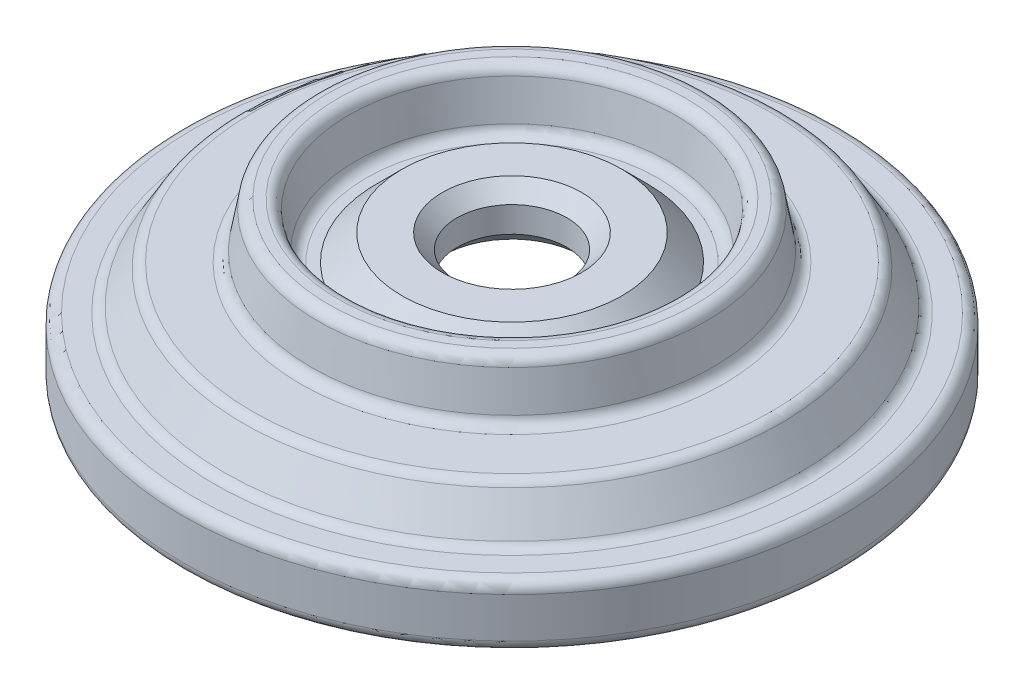
ISO-10303-21;
HEADER;
FILE_DESCRIPTION(('STEP AP214'),'2;1');
FILE_NAME('part.step','',(''),(''),'','','');
FILE_SCHEMA(('AUTOMOTIVE_DESIGN { 1 0 10303 214 1 1 1 1 }'));
ENDSEC;
DATA;
#1=APPLICATION_CONTEXT('core data for automotive mechanical design processes');
#2=APPLICATION_PROTOCOL_DEFINITION('international standard','automotive_design',2000,#1);
#3=PRODUCT_CONTEXT('',#1,'mechanical');
#4=PRODUCT('Part','Part','',(#3));
#5=PRODUCT_RELATED_PRODUCT_CATEGORY('part','',(#4));
#6=PRODUCT_DEFINITION_FORMATION('','',#4);
#7=PRODUCT_DEFINITION_CONTEXT('part definition',#1,'design');
#8=PRODUCT_DEFINITION('design','',#6,#7);
#9=PRODUCT_DEFINITION_SHAPE('','',#8);
#10=(LENGTH_UNIT() NAMED_UNIT(*) SI_UNIT(.MILLI.,.METRE.));
#11=(NAMED_UNIT(*) PLANE_ANGLE_UNIT() SI_UNIT($,.RADIAN.));
#12=(NAMED_UNIT(*) SI_UNIT($,.STERADIAN.) SOLID_ANGLE_UNIT());
#13=UNCERTAINTY_MEASURE_WITH_UNIT(LENGTH_MEASURE(1.E-05),#10,'distance_accuracy_value','');
#14=(GEOMETRIC_REPRESENTATION_CONTEXT(3) GLOBAL_UNCERTAINTY_ASSIGNED_CONTEXT((#13)) GLOBAL_UNIT_ASSIGNED_CONTEXT((#10,
#11,#12)) REPRESENTATION_CONTEXT('',''));
#15=CARTESIAN_POINT('',(0.,0.,0.));
#16=DIRECTION('',(0.,0.,1.));
#17=DIRECTION('',(1.,0.,0.));
#18=AXIS2_PLACEMENT_3D('',#15,#16,#17);
#19=CARTESIAN_POINT('',(0.,3.00000000000001,0.));
#20=DIRECTION('',(0.,-1.,0.));
#21=DIRECTION('',(0.,0.,-1.));
#22=AXIS2_PLACEMENT_3D('',#19,#20,#21);
#23=TOROIDAL_SURFACE('',#22,87.,3.);
#24=CARTESIAN_POINT('',(0.,0.,0.));
#25=DIRECTION('',(0.,-1.,0.));
#26=DIRECTION('',(0.,0.,-1.));
#27=AXIS2_PLACEMENT_3D('',#24,#25,#26);
#28=CIRCLE('',#27,87.);
#29=CARTESIAN_POINT('',(0.,0.,-87.));
#30=VERTEX_POINT('',#29);
#31=EDGE_CURVE('E118',#30,#30,#28,.T.);
#32=ORIENTED_EDGE('',*,*,#31,.F.);
#33=EDGE_LOOP('',(#32));
#34=FACE_BOUND('',#33,.T.);
#35=CARTESIAN_POINT('',(0.,3.00000000000003,0.));
#36=DIRECTION('',(0.,-1.,0.));
#37=DIRECTION('',(0.,0.,-1.));
#38=AXIS2_PLACEMENT_3D('',#35,#36,#37);
#39=CIRCLE('',#38,90.);
#40=CARTESIAN_POINT('',(0.,3.00000000000003,-90.));
#41=VERTEX_POINT('',#40);
#42=EDGE_CURVE('E10',#41,#41,#39,.T.);
#43=ORIENTED_EDGE('',*,*,#42,.T.);
#44=EDGE_LOOP('',(#43));
#45=FACE_BOUND('',#44,.T.);
#46=ADVANCED_FACE('F39',(#34,#45),#23,.T.);
#47=CARTESIAN_POINT('',(0.,0.,0.));
#48=DIRECTION('',(0.,-1.,0.));
#49=DIRECTION('',(0.,0.,-1.));
#50=AXIS2_PLACEMENT_3D('',#47,#48,#49);
#51=CYLINDRICAL_SURFACE('',#50,90.);
#52=ORIENTED_EDGE('',*,*,#42,.F.);
#53=EDGE_LOOP('',(#52));
#54=FACE_BOUND('',#53,.T.);
#55=CARTESIAN_POINT('',(0.,14.,0.));
#56=DIRECTION('',(0.,-1.,0.));
#57=DIRECTION('',(0.,0.,-1.));
#58=AXIS2_PLACEMENT_3D('',#55,#56,#57);
#59=CIRCLE('',#58,90.);
#60=CARTESIAN_POINT('',(0.,14.,-90.));
#61=VERTEX_POINT('',#60);
#62=EDGE_CURVE('E45',#61,#61,#59,.T.);
#63=ORIENTED_EDGE('',*,*,#62,.T.);
#64=EDGE_LOOP('',(#63));
#65=FACE_BOUND('',#64,.T.);
#66=ADVANCED_FACE('F125',(#54,#65),#51,.T.);
#67=CARTESIAN_POINT('',(0.,14.,0.));
#68=DIRECTION('',(0.,-1.,0.));
#69=DIRECTION('',(0.,0.,-1.));
#70=AXIS2_PLACEMENT_3D('',#67,#68,#69);
#71=TOROIDAL_SURFACE('',#70,87.,3.);
#72=ORIENTED_EDGE('',*,*,#62,.F.);
#73=EDGE_LOOP('',(#72));
#74=FACE_BOUND('',#73,.T.);
#75=CARTESIAN_POINT('',(0.,17.,0.));
#76=DIRECTION('',(0.,-1.,0.));
#77=DIRECTION('',(0.,0.,-1.));
#78=AXIS2_PLACEMENT_3D('',#75,#76,#77);
#79=CIRCLE('',#78,87.);
#80=CARTESIAN_POINT('',(0.,17.,-87.));
#81=VERTEX_POINT('',#80);
#82=EDGE_CURVE('E49',#81,#81,#79,.T.);
#83=ORIENTED_EDGE('',*,*,#82,.T.);
#84=EDGE_LOOP('',(#83));
#85=FACE_BOUND('',#84,.T.);
#86=ADVANCED_FACE('F129',(#74,#85),#71,.T.);
#87=CARTESIAN_POINT('',(0.,17.,0.));
#88=DIRECTION('',(0.,-1.,0.));
#89=DIRECTION('',(0.,0.,-1.));
#90=AXIS2_PLACEMENT_3D('',#87,#88,#89);
#91=PLANE('',#90);
#92=ORIENTED_EDGE('',*,*,#82,.F.);
#93=EDGE_LOOP('',(#92));
#94=FACE_BOUND('',#93,.T.);
#95=CARTESIAN_POINT('',(0.,17.,0.));
#96=DIRECTION('',(0.,-1.,0.));
#97=DIRECTION('',(0.,0.,-1.));
#98=AXIS2_PLACEMENT_3D('',#95,#96,#97);
#99=CIRCLE('',#98,81.1547005383793);
#100=CARTESIAN_POINT('',(0.,17.,-81.1547005383793));
#101=VERTEX_POINT('',#100);
#102=EDGE_CURVE('E53',#101,#101,#99,.T.);
#103=ORIENTED_EDGE('',*,*,#102,.T.);
#104=EDGE_LOOP('',(#103));
#105=FACE_BOUND('',#104,.T.);
#106=ADVANCED_FACE('F134',(#94,#105),#91,.F.);
#107=CARTESIAN_POINT('',(0.,20.,0.));
#108=DIRECTION('',(0.,-1.,0.));
#109=DIRECTION('',(0.,0.,-1.));
#110=AXIS2_PLACEMENT_3D('',#107,#108,#109);
#111=TOROIDAL_SURFACE('',#110,81.1547005383793,3.);
#112=ORIENTED_EDGE('',*,*,#102,.F.);
#113=EDGE_LOOP('',(#112));
#114=FACE_BOUND('',#113,.T.);
#115=CARTESIAN_POINT('',(0.,18.5,0.));
#116=DIRECTION('',(0.,-1.,0.));
#117=DIRECTION('',(0.,0.,-1.));
#118=AXIS2_PLACEMENT_3D('',#115,#116,#117);
#119=CIRCLE('',#118,78.556624327026);
#120=CARTESIAN_POINT('',(0.,18.5,-78.556624327026));
#121=VERTEX_POINT('',#120);
#122=EDGE_CURVE('E58',#121,#121,#119,.T.);
#123=ORIENTED_EDGE('',*,*,#122,.T.);
#124=EDGE_LOOP('',(#123));
#125=FACE_BOUND('',#124,.T.);
#126=ADVANCED_FACE('F140',(#114,#125),#111,.F.);
#127=CARTESIAN_POINT('',(0.,27.5,0.));
#128=DIRECTION('',(0.,-1.,0.));
#129=DIRECTION('',(0.,0.,-1.));
#130=AXIS2_PLACEMENT_3D('',#127,#128,#129);
#131=CONICAL_SURFACE('',#130,73.3604719043194,0.523598775598296);
#132=ORIENTED_EDGE('',*,*,#122,.F.);
#133=EDGE_LOOP('',(#132));
#134=FACE_BOUND('',#133,.T.);
#135=CARTESIAN_POINT('',(0.,27.5,0.));
#136=DIRECTION('',(0.,-1.,0.));
#137=DIRECTION('',(0.,0.,-1.));
#138=AXIS2_PLACEMENT_3D('',#135,#136,#137);
#139=CIRCLE('',#138,73.3604719043194);
#140=CARTESIAN_POINT('',(0.,27.5,-73.3604719043194));
#141=VERTEX_POINT('',#140);
#142=EDGE_CURVE('E61',#141,#141,#139,.T.);
#143=ORIENTED_EDGE('',*,*,#142,.T.);
#144=EDGE_LOOP('',(#143));
#145=FACE_BOUND('',#144,.T.);
#146=ADVANCED_FACE('F144',(#134,#145),#131,.T.);
#147=CARTESIAN_POINT('',(0.,26.,0.));
#148=DIRECTION('',(0.,-1.,0.));
#149=DIRECTION('',(0.,0.,-1.));
#150=AXIS2_PLACEMENT_3D('',#147,#148,#149);
#151=TOROIDAL_SURFACE('',#150,70.7623956929661,3.00000000000001);
#152=ORIENTED_EDGE('',*,*,#142,.F.);
#153=EDGE_LOOP('',(#152));
#154=FACE_BOUND('',#153,.T.);
#155=CARTESIAN_POINT('',(0.,29.,0.));
#156=DIRECTION('',(0.,-1.,0.));
#157=DIRECTION('',(0.,0.,-1.));
#158=AXIS2_PLACEMENT_3D('',#155,#156,#157);
#159=CIRCLE('',#158,70.762395692966);
#160=CARTESIAN_POINT('',(0.,29.,-70.762395692966));
#161=VERTEX_POINT('',#160);
#162=EDGE_CURVE('E64',#161,#161,#159,.T.);
#163=ORIENTED_EDGE('',*,*,#162,.T.);
#164=EDGE_LOOP('',(#163));
#165=FACE_BOUND('',#164,.T.);
#166=ADVANCED_FACE('F148',(#154,#165),#151,.T.);
#167=CARTESIAN_POINT('',(0.,29.,0.));
#168=DIRECTION('',(0.,-1.,0.));
#169=DIRECTION('',(0.,0.,-1.));
#170=AXIS2_PLACEMENT_3D('',#167,#168,#169);
#171=PLANE('',#170);
#172=ORIENTED_EDGE('',*,*,#162,.F.);
#173=EDGE_LOOP('',(#172));
#174=FACE_BOUND('',#173,.T.);
#175=CARTESIAN_POINT('',(0.,29.,0.));
#176=DIRECTION('',(0.,-1.,0.));
#177=DIRECTION('',(0.,0.,-1.));
#178=AXIS2_PLACEMENT_3D('',#175,#176,#177);
#179=CIRCLE('',#178,57.7250792386539);
#180=CARTESIAN_POINT('',(0.,29.,-57.7250792386539));
#181=VERTEX_POINT('',#180);
#182=EDGE_CURVE('E67',#181,#181,#179,.T.);
#183=ORIENTED_EDGE('',*,*,#182,.T.);
#184=EDGE_LOOP('',(#183));
#185=FACE_BOUND('',#184,.T.);
#186=ADVANCED_FACE('F152',(#174,#185),#171,.F.);
#187=CARTESIAN_POINT('',(0.,32.,0.));
#188=DIRECTION('',(0.,-1.,0.));
#189=DIRECTION('',(0.,0.,-1.));
#190=AXIS2_PLACEMENT_3D('',#187,#188,#189);
#191=TOROIDAL_SURFACE('',#190,57.7250792386539,3.);
#192=ORIENTED_EDGE('',*,*,#182,.F.);
#193=EDGE_LOOP('',(#192));
#194=FACE_BOUND('',#193,.T.);
#195=CARTESIAN_POINT('',(0.,31.4790554669992,0.));
#196=DIRECTION('',(0.,-1.,0.));
#197=DIRECTION('',(0.,0.,-1.));
#198=AXIS2_PLACEMENT_3D('',#195,#196,#197);
#199=CIRCLE('',#198,54.7706559796173);
#200=CARTESIAN_POINT('',(0.,31.4790554669992,-54.7706559796173));
#201=VERTEX_POINT('',#200);
#202=EDGE_CURVE('E70',#201,#201,#199,.T.);
#203=ORIENTED_EDGE('',*,*,#202,.T.);
#204=EDGE_LOOP('',(#203));
#205=FACE_BOUND('',#204,.T.);
#206=ADVANCED_FACE('F156',(#194,#205),#191,.F.);
#207=CARTESIAN_POINT('',(0.,31.4790554669992,0.));
#208=DIRECTION('',(0.,-1.,0.));
#209=DIRECTION('',(0.,0.,-1.));
#210=AXIS2_PLACEMENT_3D('',#207,#208,#209);
#211=CONICAL_SURFACE('',#210,54.7706559796173,0.174532925199425);
#212=CARTESIAN_POINT('',(0.,41.5209445330008,0.));
#213=DIRECTION('',(0.,-1.,0.));
#214=DIRECTION('',(0.,0.,-1.));
#215=AXIS2_PLACEMENT_3D('',#212,#213,#214);
#216=CIRCLE('',#215,53.);
#217=CARTESIAN_POINT('',(0.,41.5209445330008,-53.));
#218=VERTEX_POINT('',#217);
#219=EDGE_CURVE('E73',#218,#218,#216,.T.);
#220=ORIENTED_EDGE('',*,*,#219,.T.);
#221=EDGE_LOOP('',(#220));
#222=FACE_BOUND('',#221,.T.);
#223=ORIENTED_EDGE('',*,*,#202,.F.);
#224=EDGE_LOOP('',(#223));
#225=FACE_BOUND('',#224,.T.);
#226=ADVANCED_FACE('F160',(#222,#225),#211,.T.);
#227=CARTESIAN_POINT('',(0.,41.,0.));
#228=DIRECTION('',(0.,-1.,0.));
#229=DIRECTION('',(0.,0.,-1.));
#230=AXIS2_PLACEMENT_3D('',#227,#228,#229);
#231=TOROIDAL_SURFACE('',#230,50.0455767409634,3.);
#232=ORIENTED_EDGE('',*,*,#219,.F.);
#233=EDGE_LOOP('',(#232));
#234=FACE_BOUND('',#233,.T.);
#235=CARTESIAN_POINT('',(0.,44.,0.));
#236=DIRECTION('',(0.,-1.,0.));
#237=DIRECTION('',(0.,0.,-1.));
#238=AXIS2_PLACEMENT_3D('',#235,#236,#237);
#239=CIRCLE('',#238,50.0455767409634);
#240=CARTESIAN_POINT('',(0.,44.,-50.0455767409634));
#241=VERTEX_POINT('',#240);
#242=EDGE_CURVE('E76',#241,#241,#239,.T.);
#243=ORIENTED_EDGE('',*,*,#242,.T.);
#244=EDGE_LOOP('',(#243));
#245=FACE_BOUND('',#244,.T.);
#246=ADVANCED_FACE('F164',(#234,#245),#231,.T.);
#247=CARTESIAN_POINT('',(2.3947475092458E-13,44.,0.));
#248=DIRECTION('',(0.,-1.,0.));
#249=DIRECTION('',(0.,0.,-1.));
#250=AXIS2_PLACEMENT_3D('',#247,#248,#249);
#251=PLANE('',#250);
#252=ORIENTED_EDGE('',*,*,#242,.F.);
#253=EDGE_LOOP('',(#252));
#254=FACE_BOUND('',#253,.T.);
#255=CARTESIAN_POINT('',(0.,44.,0.));
#256=DIRECTION('',(0.,-1.,0.));
#257=DIRECTION('',(0.,0.,-1.));
#258=AXIS2_PLACEMENT_3D('',#255,#256,#257);
#259=CIRCLE('',#258,47.4957352182713);
#260=CARTESIAN_POINT('',(0.,44.,-47.4957352182713));
#261=VERTEX_POINT('',#260);
#262=EDGE_CURVE('E79',#261,#261,#259,.T.);
#263=ORIENTED_EDGE('',*,*,#262,.T.);
#264=EDGE_LOOP('',(#263));
#265=FACE_BOUND('',#264,.T.);
#266=ADVANCED_FACE('F168',(#254,#265),#251,.F.);
#267=CARTESIAN_POINT('',(0.,41.,0.));
#268=DIRECTION('',(0.,-1.,0.));
#269=DIRECTION('',(0.,0.,-1.));
#270=AXIS2_PLACEMENT_3D('',#267,#268,#269);
#271=TOROIDAL_SURFACE('',#270,47.4957352182713,3.);
#272=CARTESIAN_POINT('',(0.,41.5209445330008,0.));
#273=DIRECTION('',(0.,-1.,0.));
#274=DIRECTION('',(0.,0.,-1.));
#275=AXIS2_PLACEMENT_3D('',#272,#273,#274);
#276=CIRCLE('',#275,44.5413119592346);
#277=CARTESIAN_POINT('',(0.,41.5209445330008,-44.5413119592346));
#278=VERTEX_POINT('',#277);
#279=EDGE_CURVE('E82',#278,#278,#276,.T.);
#280=ORIENTED_EDGE('',*,*,#279,.T.);
#281=EDGE_LOOP('',(#280));
#282=FACE_BOUND('',#281,.T.);
#283=ORIENTED_EDGE('',*,*,#262,.F.);
#284=EDGE_LOOP('',(#283));
#285=FACE_BOUND('',#284,.T.);
#286=ADVANCED_FACE('F172',(#282,#285),#271,.T.);
#287=CARTESIAN_POINT('',(0.,31.4790554669992,0.));
#288=DIRECTION('',(0.,1.,0.));
#289=DIRECTION('',(0.,0.,1.));
#290=AXIS2_PLACEMENT_3D('',#287,#288,#289);
#291=CONICAL_SURFACE('',#290,42.7706559796173,0.174532925199426);
#292=ORIENTED_EDGE('',*,*,#279,.F.);
#293=EDGE_LOOP('',(#292));
#294=FACE_BOUND('',#293,.T.);
#295=CARTESIAN_POINT('',(0.,31.4790554669992,0.));
#296=DIRECTION('',(0.,-1.,0.));
#297=DIRECTION('',(0.,0.,-1.));
#298=AXIS2_PLACEMENT_3D('',#295,#296,#297);
#299=CIRCLE('',#298,42.7706559796173);
#300=CARTESIAN_POINT('',(0.,31.4790554669992,-42.7706559796173));
#301=VERTEX_POINT('',#300);
#302=EDGE_CURVE('E85',#301,#301,#299,.T.);
#303=ORIENTED_EDGE('',*,*,#302,.T.);
#304=EDGE_LOOP('',(#303));
#305=FACE_BOUND('',#304,.T.);
#306=ADVANCED_FACE('F176',(#294,#305),#291,.F.);
#307=CARTESIAN_POINT('',(0.,32.,0.));
#308=DIRECTION('',(0.,-1.,0.));
#309=DIRECTION('',(0.,0.,-1.));
#310=AXIS2_PLACEMENT_3D('',#307,#308,#309);
#311=TOROIDAL_SURFACE('',#310,39.8162327205807,3.);
#312=ORIENTED_EDGE('',*,*,#302,.F.);
#313=EDGE_LOOP('',(#312));
#314=FACE_BOUND('',#313,.T.);
#315=CARTESIAN_POINT('',(0.,29.,0.));
#316=DIRECTION('',(0.,-1.,0.));
#317=DIRECTION('',(0.,0.,-1.));
#318=AXIS2_PLACEMENT_3D('',#315,#316,#317);
#319=CIRCLE('',#318,39.8162327205807);
#320=CARTESIAN_POINT('',(0.,29.,-39.8162327205807));
#321=VERTEX_POINT('',#320);
#322=EDGE_CURVE('E88',#321,#321,#319,.T.);
#323=ORIENTED_EDGE('',*,*,#322,.T.);
#324=EDGE_LOOP('',(#323));
#325=FACE_BOUND('',#324,.T.);
#326=ADVANCED_FACE('F180',(#314,#325),#311,.F.);
#327=CARTESIAN_POINT('',(0.,29.,0.));
#328=DIRECTION('',(0.,-1.,0.));
#329=DIRECTION('',(0.,0.,-1.));
#330=AXIS2_PLACEMENT_3D('',#327,#328,#329);
#331=PLANE('',#330);
#332=ORIENTED_EDGE('',*,*,#322,.F.);
#333=EDGE_LOOP('',(#332));
#334=FACE_BOUND('',#333,.T.);
#335=CARTESIAN_POINT('',(0.,29.,0.));
#336=DIRECTION('',(0.,-1.,0.));
#337=DIRECTION('',(0.,0.,-1.));
#338=AXIS2_PLACEMENT_3D('',#335,#336,#337);
#339=CIRCLE('',#338,37.);
#340=CARTESIAN_POINT('',(0.,29.,-37.));
#341=VERTEX_POINT('',#340);
#342=EDGE_CURVE('E91',#341,#341,#339,.T.);
#343=ORIENTED_EDGE('',*,*,#342,.T.);
#344=EDGE_LOOP('',(#343));
#345=FACE_BOUND('',#344,.T.);
#346=ADVANCED_FACE('F184',(#334,#345),#331,.F.);
#347=CARTESIAN_POINT('',(0.,36.,0.));
#348=DIRECTION('',(0.,-1.,0.));
#349=DIRECTION('',(0.,0.,-1.));
#350=AXIS2_PLACEMENT_3D('',#347,#348,#349);
#351=CONICAL_SURFACE('',#350,30.,0.785398163397447);
#352=ORIENTED_EDGE('',*,*,#342,.F.);
#353=EDGE_LOOP('',(#352));
#354=FACE_BOUND('',#353,.T.);
#355=CARTESIAN_POINT('',(0.,36.,0.));
#356=DIRECTION('',(0.,-1.,0.));
#357=DIRECTION('',(0.,0.,-1.));
#358=AXIS2_PLACEMENT_3D('',#355,#356,#357);
#359=CIRCLE('',#358,30.);
#360=CARTESIAN_POINT('',(0.,36.,-30.));
#361=VERTEX_POINT('',#360);
#362=EDGE_CURVE('E94',#361,#361,#359,.T.);
#363=ORIENTED_EDGE('',*,*,#362,.T.);
#364=EDGE_LOOP('',(#363));
#365=FACE_BOUND('',#364,.T.);
#366=ADVANCED_FACE('F188',(#354,#365),#351,.T.);
#367=CARTESIAN_POINT('',(0.,36.,0.));
#368=DIRECTION('',(0.,-1.,0.));
#369=DIRECTION('',(0.,0.,-1.));
#370=AXIS2_PLACEMENT_3D('',#367,#368,#369);
#371=PLANE('',#370);
#372=ORIENTED_EDGE('',*,*,#362,.F.);
#373=EDGE_LOOP('',(#372));
#374=FACE_BOUND('',#373,.T.);
#375=CARTESIAN_POINT('',(0.,36.,0.));
#376=DIRECTION('',(0.,-1.,0.));
#377=DIRECTION('',(0.,0.,-1.));
#378=AXIS2_PLACEMENT_3D('',#375,#376,#377);
#379=CIRCLE('',#378,19.);
#380=CARTESIAN_POINT('',(0.,36.,-19.));
#381=VERTEX_POINT('',#380);
#382=EDGE_CURVE('E97',#381,#381,#379,.T.);
#383=ORIENTED_EDGE('',*,*,#382,.T.);
#384=EDGE_LOOP('',(#383));
#385=FACE_BOUND('',#384,.T.);
#386=ADVANCED_FACE('F192',(#374,#385),#371,.F.);
#387=CARTESIAN_POINT('',(0.,32.,0.));
#388=DIRECTION('',(0.,1.,0.));
#389=DIRECTION('',(0.,0.,1.));
#390=AXIS2_PLACEMENT_3D('',#387,#388,#389);
#391=CONICAL_SURFACE('',#390,15.,0.785398163397448);
#392=ORIENTED_EDGE('',*,*,#382,.F.);
#393=EDGE_LOOP('',(#392));
#394=FACE_BOUND('',#393,.T.);
#395=CARTESIAN_POINT('',(0.,32.,0.));
#396=DIRECTION('',(0.,-1.,0.));
#397=DIRECTION('',(0.,0.,-1.));
#398=AXIS2_PLACEMENT_3D('',#395,#396,#397);
#399=CIRCLE('',#398,15.);
#400=CARTESIAN_POINT('',(0.,32.,-15.));
#401=VERTEX_POINT('',#400);
#402=EDGE_CURVE('E100',#401,#401,#399,.T.);
#403=ORIENTED_EDGE('',*,*,#402,.T.);
#404=EDGE_LOOP('',(#403));
#405=FACE_BOUND('',#404,.T.);
#406=ADVANCED_FACE('F196',(#394,#405),#391,.F.);
#407=CARTESIAN_POINT('',(0.,0.,0.));
#408=DIRECTION('',(0.,-1.,0.));
#409=DIRECTION('',(0.,0.,-1.));
#410=AXIS2_PLACEMENT_3D('',#407,#408,#409);
#411=CYLINDRICAL_SURFACE('',#410,15.);
#412=ORIENTED_EDGE('',*,*,#402,.F.);
#413=EDGE_LOOP('',(#412));
#414=FACE_BOUND('',#413,.T.);
#415=CARTESIAN_POINT('',(0.,25.,0.));
#416=DIRECTION('',(0.,-1.,0.));
#417=DIRECTION('',(0.,0.,-1.));
#418=AXIS2_PLACEMENT_3D('',#415,#416,#417);
#419=CIRCLE('',#418,15.);
#420=CARTESIAN_POINT('',(0.,25.,-15.));
#421=VERTEX_POINT('',#420);
#422=EDGE_CURVE('E103',#421,#421,#419,.T.);
#423=ORIENTED_EDGE('',*,*,#422,.T.);
#424=EDGE_LOOP('',(#423));
#425=FACE_BOUND('',#424,.T.);
#426=ADVANCED_FACE('F200',(#414,#425),#411,.F.);
#427=CARTESIAN_POINT('',(0.,21.,0.));
#428=DIRECTION('',(0.,-1.,0.));
#429=DIRECTION('',(0.,0.,-1.));
#430=AXIS2_PLACEMENT_3D('',#427,#428,#429);
#431=CONICAL_SURFACE('',#430,19.,0.785398163397447);
#432=ORIENTED_EDGE('',*,*,#422,.F.);
#433=EDGE_LOOP('',(#432));
#434=FACE_BOUND('',#433,.T.);
#435=CARTESIAN_POINT('',(0.,21.,0.));
#436=DIRECTION('',(0.,-1.,0.));
#437=DIRECTION('',(0.,0.,-1.));
#438=AXIS2_PLACEMENT_3D('',#435,#436,#437);
#439=CIRCLE('',#438,19.);
#440=CARTESIAN_POINT('',(0.,21.,-19.));
#441=VERTEX_POINT('',#440);
#442=EDGE_CURVE('E106',#441,#441,#439,.T.);
#443=ORIENTED_EDGE('',*,*,#442,.T.);
#444=EDGE_LOOP('',(#443));
#445=FACE_BOUND('',#444,.T.);
#446=ADVANCED_FACE('F204',(#434,#445),#431,.F.);
#447=CARTESIAN_POINT('',(0.,21.,0.));
#448=DIRECTION('',(0.,1.,0.));
#449=DIRECTION('',(0.,0.,1.));
#450=AXIS2_PLACEMENT_3D('',#447,#448,#449);
#451=PLANE('',#450);
#452=ORIENTED_EDGE('',*,*,#442,.F.);
#453=EDGE_LOOP('',(#452));
#454=FACE_BOUND('',#453,.T.);
#455=CARTESIAN_POINT('',(0.,21.,0.));
#456=DIRECTION('',(0.,-1.,0.));
#457=DIRECTION('',(0.,0.,-1.));
#458=AXIS2_PLACEMENT_3D('',#455,#456,#457);
#459=CIRCLE('',#458,66.143593539449);
#460=CARTESIAN_POINT('',(0.,21.,-66.143593539449));
#461=VERTEX_POINT('',#460);
#462=EDGE_CURVE('E109',#461,#461,#459,.T.);
#463=ORIENTED_EDGE('',*,*,#462,.T.);
#464=EDGE_LOOP('',(#463));
#465=FACE_BOUND('',#464,.T.);
#466=ADVANCED_FACE('F208',(#454,#465),#451,.F.);
#467=CARTESIAN_POINT('',(0.,18.,0.));
#468=DIRECTION('',(0.,-1.,0.));
#469=DIRECTION('',(0.,0.,-1.));
#470=AXIS2_PLACEMENT_3D('',#467,#468,#469);
#471=TOROIDAL_SURFACE('',#470,66.143593539449,3.);
#472=ORIENTED_EDGE('',*,*,#462,.F.);
#473=EDGE_LOOP('',(#472));
#474=FACE_BOUND('',#473,.T.);
#475=CARTESIAN_POINT('',(0.,19.5,0.));
#476=DIRECTION('',(0.,-1.,0.));
#477=DIRECTION('',(0.,0.,-1.));
#478=AXIS2_PLACEMENT_3D('',#475,#476,#477);
#479=CIRCLE('',#478,68.7416697508023);
#480=CARTESIAN_POINT('',(0.,19.5,-68.7416697508023));
#481=VERTEX_POINT('',#480);
#482=EDGE_CURVE('E112',#481,#481,#479,.T.);
#483=ORIENTED_EDGE('',*,*,#482,.T.);
#484=EDGE_LOOP('',(#483));
#485=FACE_BOUND('',#484,.T.);
#486=ADVANCED_FACE('F212',(#474,#485),#471,.F.);
#487=CARTESIAN_POINT('',(0.,0.,0.));
#488=DIRECTION('',(0.,-1.,0.));
#489=DIRECTION('',(0.,0.,-1.));
#490=AXIS2_PLACEMENT_3D('',#487,#488,#489);
#491=CONICAL_SURFACE('',#490,80.,0.523598775598297);
#492=ORIENTED_EDGE('',*,*,#482,.F.);
#493=EDGE_LOOP('',(#492));
#494=FACE_BOUND('',#493,.T.);
#495=CARTESIAN_POINT('',(0.,0.,0.));
#496=DIRECTION('',(0.,-1.,0.));
#497=DIRECTION('',(0.,0.,-1.));
#498=AXIS2_PLACEMENT_3D('',#495,#496,#497);
#499=CIRCLE('',#498,80.);
#500=CARTESIAN_POINT('',(0.,0.,-80.));
#501=VERTEX_POINT('',#500);
#502=EDGE_CURVE('E115',#501,#501,#499,.T.);
#503=ORIENTED_EDGE('',*,*,#502,.T.);
#504=EDGE_LOOP('',(#503));
#505=FACE_BOUND('',#504,.T.);
#506=ADVANCED_FACE('F216',(#494,#505),#491,.F.);
#507=CARTESIAN_POINT('',(0.,0.,0.));
#508=DIRECTION('',(0.,1.,0.));
#509=DIRECTION('',(0.,0.,1.));
#510=AXIS2_PLACEMENT_3D('',#507,#508,#509);
#511=PLANE('',#510);
#512=ORIENTED_EDGE('',*,*,#502,.F.);
#513=EDGE_LOOP('',(#512));
#514=FACE_BOUND('',#513,.T.);
#515=ORIENTED_EDGE('',*,*,#31,.T.);
#516=EDGE_LOOP('',(#515));
#517=FACE_BOUND('',#516,.T.);
#518=ADVANCED_FACE('F122',(#514,#517),#511,.F.);
#519=CLOSED_SHELL('',(#46,#66,#86,#106,#126,#146,#166,#186,#206,#226,#246,#266,#286,#306,#326,
#346,#366,#386,#406,#426,#446,#466,#486,#506,#518));
#520=MANIFOLD_SOLID_BREP('B2',#519);
#521=ADVANCED_BREP_SHAPE_REPRESENTATION('',(#18,#520),#14);
#522=SHAPE_DEFINITION_REPRESENTATION(#9,#521);
ENDSEC;
END-ISO-10303-21;
